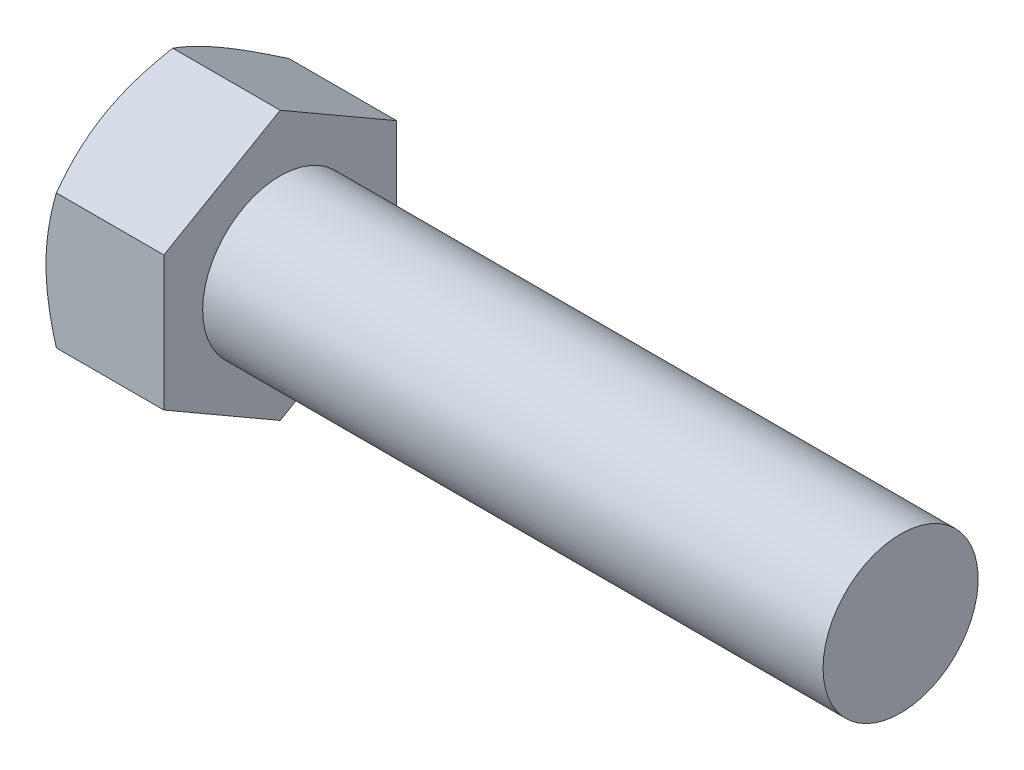
ISO-10303-21;
HEADER;
FILE_DESCRIPTION(('STEP AP214'),'2;1');
FILE_NAME('part.step','',(''),(''),'','','');
FILE_SCHEMA(('AUTOMOTIVE_DESIGN { 1 0 10303 214 1 1 1 1 }'));
ENDSEC;
DATA;
#1=APPLICATION_CONTEXT('core data for automotive mechanical design processes');
#2=APPLICATION_PROTOCOL_DEFINITION('international standard','automotive_design',2000,#1);
#3=PRODUCT_CONTEXT('',#1,'mechanical');
#4=PRODUCT('Part','Part','',(#3));
#5=PRODUCT_RELATED_PRODUCT_CATEGORY('part','',(#4));
#6=PRODUCT_DEFINITION_FORMATION('','',#4);
#7=PRODUCT_DEFINITION_CONTEXT('part definition',#1,'design');
#8=PRODUCT_DEFINITION('design','',#6,#7);
#9=PRODUCT_DEFINITION_SHAPE('','',#8);
#10=(LENGTH_UNIT() NAMED_UNIT(*) SI_UNIT(.MILLI.,.METRE.));
#11=(NAMED_UNIT(*) PLANE_ANGLE_UNIT() SI_UNIT($,.RADIAN.));
#12=(NAMED_UNIT(*) SI_UNIT($,.STERADIAN.) SOLID_ANGLE_UNIT());
#13=UNCERTAINTY_MEASURE_WITH_UNIT(LENGTH_MEASURE(1.E-05),#10,'distance_accuracy_value','');
#14=(GEOMETRIC_REPRESENTATION_CONTEXT(3) GLOBAL_UNCERTAINTY_ASSIGNED_CONTEXT((#13)) GLOBAL_UNIT_ASSIGNED_CONTEXT((#10,
#11,#12)) REPRESENTATION_CONTEXT('',''));
#15=CARTESIAN_POINT('',(0.,0.,0.));
#16=DIRECTION('',(0.,0.,1.));
#17=DIRECTION('',(1.,0.,0.));
#18=AXIS2_PLACEMENT_3D('',#15,#16,#17);
#19=CARTESIAN_POINT('',(4.826,3.175,0.));
#20=DIRECTION('',(-1.,0.,0.));
#21=DIRECTION('',(0.,0.,1.));
#22=AXIS2_PLACEMENT_3D('',#19,#20,#21);
#23=PLANE('',#22);
#24=CARTESIAN_POINT('',(4.826,0.,0.));
#25=DIRECTION('',(-1.,0.,0.));
#26=DIRECTION('',(0.,0.,1.));
#27=AXIS2_PLACEMENT_3D('',#24,#25,#26);
#28=CIRCLE('',#27,3.175);
#29=CARTESIAN_POINT('',(4.826,0.,3.175));
#30=VERTEX_POINT('',#29);
#31=EDGE_CURVE('E192',#30,#30,#28,.T.);
#32=ORIENTED_EDGE('',*,*,#31,.T.);
#33=EDGE_LOOP('',(#32));
#34=FACE_BOUND('',#33,.T.);
#35=DIRECTION('',(0.,1.,0.));
#36=VECTOR('',#35,1.);
#37=CARTESIAN_POINT('',(4.826,-2.74963066903106,4.7625));
#38=LINE('',#37,#36);
#39=CARTESIAN_POINT('',(4.826,-2.74963066903106,4.7625));
#40=VERTEX_POINT('',#39);
#41=CARTESIAN_POINT('',(4.826,2.74963066903132,4.7625));
#42=VERTEX_POINT('',#41);
#43=EDGE_CURVE('E56',#40,#42,#38,.T.);
#44=ORIENTED_EDGE('',*,*,#43,.F.);
#45=DIRECTION('',(0.,0.50000000163871,0.866025402838329));
#46=VECTOR('',#45,1.);
#47=CARTESIAN_POINT('',(4.826,-5.49926133806224,0.));
#48=LINE('',#47,#46);
#49=CARTESIAN_POINT('',(4.826,-5.49926133806224,0.));
#50=VERTEX_POINT('',#49);
#51=EDGE_CURVE('E129',#50,#40,#48,.T.);
#52=ORIENTED_EDGE('',*,*,#51,.F.);
#53=DIRECTION('',(0.,-0.50000000163871,0.866025402838329));
#54=VECTOR('',#53,1.);
#55=CARTESIAN_POINT('',(4.826,-2.74963066903106,-4.7625));
#56=LINE('',#55,#54);
#57=CARTESIAN_POINT('',(4.826,-2.74963066903106,-4.7625));
#58=VERTEX_POINT('',#57);
#59=EDGE_CURVE('E127',#58,#50,#56,.T.);
#60=ORIENTED_EDGE('',*,*,#59,.F.);
#61=DIRECTION('',(0.,-1.,0.));
#62=VECTOR('',#61,1.);
#63=CARTESIAN_POINT('',(4.826,2.74963066903132,-4.7625));
#64=LINE('',#63,#62);
#65=CARTESIAN_POINT('',(4.826,2.74963066903132,-4.7625));
#66=VERTEX_POINT('',#65);
#67=EDGE_CURVE('E110',#66,#58,#64,.T.);
#68=ORIENTED_EDGE('',*,*,#67,.F.);
#69=DIRECTION('',(0.,-0.50000000163871,-0.866025402838329));
#70=VECTOR('',#69,1.);
#71=CARTESIAN_POINT('',(4.826,5.4992613380625,0.));
#72=LINE('',#71,#70);
#73=CARTESIAN_POINT('',(4.826,5.4992613380625,0.));
#74=VERTEX_POINT('',#73);
#75=EDGE_CURVE('E119',#74,#66,#72,.T.);
#76=ORIENTED_EDGE('',*,*,#75,.F.);
#77=DIRECTION('',(0.,0.50000000163871,-0.866025402838329));
#78=VECTOR('',#77,1.);
#79=CARTESIAN_POINT('',(4.826,2.74963066903132,4.7625));
#80=LINE('',#79,#78);
#81=EDGE_CURVE('E123',#42,#74,#80,.T.);
#82=ORIENTED_EDGE('',*,*,#81,.F.);
#83=EDGE_LOOP('',(#44,#52,#60,#68,#76,#82));
#84=FACE_BOUND('',#83,.T.);
#85=ADVANCED_FACE('F33',(#34,#84),#23,.F.);
#86=CARTESIAN_POINT('',(-25.4,0.,0.));
#87=DIRECTION('',(-1.,0.,0.));
#88=DIRECTION('',(0.,0.,1.));
#89=AXIS2_PLACEMENT_3D('',#86,#87,#88);
#90=CYLINDRICAL_SURFACE('',#89,3.175);
#91=CARTESIAN_POINT('',(30.226,0.,0.));
#92=DIRECTION('',(-1.,0.,0.));
#93=DIRECTION('',(0.,0.,1.));
#94=AXIS2_PLACEMENT_3D('',#91,#92,#93);
#95=CIRCLE('',#94,3.175);
#96=CARTESIAN_POINT('',(30.226,0.,3.175));
#97=VERTEX_POINT('',#96);
#98=EDGE_CURVE('E11',#97,#97,#95,.T.);
#99=ORIENTED_EDGE('',*,*,#98,.T.);
#100=EDGE_LOOP('',(#99));
#101=FACE_BOUND('',#100,.T.);
#102=ORIENTED_EDGE('',*,*,#31,.F.);
#103=EDGE_LOOP('',(#102));
#104=FACE_BOUND('',#103,.T.);
#105=ADVANCED_FACE('F35',(#101,#104),#90,.T.);
#106=CARTESIAN_POINT('',(30.226,3.175,0.));
#107=DIRECTION('',(1.,0.,0.));
#108=DIRECTION('',(0.,0.,-1.));
#109=AXIS2_PLACEMENT_3D('',#106,#107,#108);
#110=PLANE('',#109);
#111=ORIENTED_EDGE('',*,*,#98,.F.);
#112=EDGE_LOOP('',(#111));
#113=FACE_BOUND('',#112,.T.);
#114=ADVANCED_FACE('F175',(#113),#110,.T.);
#115=CARTESIAN_POINT('',(4.826,-2.74963066903106,4.7625));
#116=DIRECTION('',(0.,0.,1.));
#117=DIRECTION('',(0.,-1.,0.));
#118=AXIS2_PLACEMENT_3D('',#115,#116,#117);
#119=PLANE('',#118);
#120=DIRECTION('',(-1.,0.,0.));
#121=VECTOR('',#120,1.);
#122=CARTESIAN_POINT('',(4.826,-2.74963066903106,4.7625));
#123=LINE('',#122,#121);
#124=CARTESIAN_POINT('',(0.425369346452972,-2.74963066903106,4.7625));
#125=VERTEX_POINT('',#124);
#126=EDGE_CURVE('E136',#40,#125,#123,.T.);
#127=ORIENTED_EDGE('',*,*,#126,.F.);
#128=ORIENTED_EDGE('',*,*,#43,.T.);
#129=DIRECTION('',(-1.,0.,0.));
#130=VECTOR('',#129,1.);
#131=CARTESIAN_POINT('',(4.826,2.74963066903132,4.7625));
#132=LINE('',#131,#130);
#133=CARTESIAN_POINT('',(0.425369346453047,2.74963066903132,4.7625));
#134=VERTEX_POINT('',#133);
#135=EDGE_CURVE('E135',#42,#134,#132,.T.);
#136=ORIENTED_EDGE('',*,*,#135,.T.);
#137=CARTESIAN_POINT('',(2.27898968394571,-7.29243864222315,4.7625));
#138=CARTESIAN_POINT('',(2.17794058217171,-7.08333786108627,4.7625));
#139=CARTESIAN_POINT('',(2.07789598854583,-6.87374269666669,4.7625));
#140=CARTESIAN_POINT('',(1.88038982686391,-6.45329629222594,4.7625));
#141=CARTESIAN_POINT('',(1.782928706027,-6.24244484236994,4.7625));
#142=CARTESIAN_POINT('',(1.59065007148966,-5.81807956190434,4.7625));
#143=CARTESIAN_POINT('',(1.49585087763059,-5.60455740055874,4.7625));
#144=CARTESIAN_POINT('',(1.31032432959035,-5.17575810623245,4.7625));
#145=CARTESIAN_POINT('',(1.21959676316398,-4.96048106542273,4.7625));
#146=CARTESIAN_POINT('',(1.04221901788485,-4.52515712229561,4.7625));
#147=CARTESIAN_POINT('',(0.955632573124922,-4.30508410805359,4.7625));
#148=CARTESIAN_POINT('',(0.789241130230124,-3.86234213608174,4.7625));
#149=CARTESIAN_POINT('',(0.709436886578048,-3.63967289266075,4.7625));
#150=CARTESIAN_POINT('',(0.558753932751852,-3.1918423334644,4.7625));
#151=CARTESIAN_POINT('',(0.48785624705175,-2.96668746712432,4.7625));
#152=CARTESIAN_POINT('',(0.357289753142522,-2.51317453212622,4.7625));
#153=CARTESIAN_POINT('',(0.297617393975245,-2.28481750106867,4.7625));
#154=CARTESIAN_POINT('',(0.192395409345153,-1.82475526773245,4.7625));
#155=CARTESIAN_POINT('',(0.146849543554863,-1.59304919127071,4.7625));
#156=CARTESIAN_POINT('',(0.0729585428796095,-1.126810996364,4.7625));
#157=CARTESIAN_POINT('',(0.0446134231880091,-0.892278875422989,4.7625));
#158=CARTESIAN_POINT('',(0.0168133679250281,-0.540107442829517,4.7625));
#159=CARTESIAN_POINT('',(0.00999820999909747,-0.423019411026591,4.7625));
#160=CARTESIAN_POINT('',(0.00132937135413627,-0.188654458262591,4.7625));
#161=CARTESIAN_POINT('',(-0.000524373797287396,-0.0713775397743245,4.7625));
#162=CARTESIAN_POINT('',(0.00077942189040161,0.163114394442293,4.7625));
#163=CARTESIAN_POINT('',(0.00393554785021348,0.280329418299315,4.7625));
#164=CARTESIAN_POINT('',(0.0151790484320769,0.514524696158315,4.7625));
#165=CARTESIAN_POINT('',(0.0232666859763377,0.63150493730927,4.7625));
#166=CARTESIAN_POINT('',(0.0486779652695836,0.9150414859633,4.7625));
#167=CARTESIAN_POINT('',(0.0684734060545629,1.08138054969973,4.7625));
#168=CARTESIAN_POINT('',(0.116932461176968,1.41275214392956,4.7625));
#169=CARTESIAN_POINT('',(0.145597258051477,1.57778449719037,4.7625));
#170=CARTESIAN_POINT('',(0.24338070321639,2.07082858080383,4.7625));
#171=CARTESIAN_POINT('',(0.324262812813244,2.39653421026766,4.7625));
#172=CARTESIAN_POINT('',(0.463764283356733,2.88389972996804,4.7625));
#173=CARTESIAN_POINT('',(0.514005661882685,3.04810170519661,4.7625));
#174=CARTESIAN_POINT('',(0.619459724259771,3.37479214932484,4.7625));
#175=CARTESIAN_POINT('',(0.674668979246428,3.53728171491266,4.7625));
#176=CARTESIAN_POINT('',(0.788910138521114,3.85986745605865,4.7625));
#177=CARTESIAN_POINT('',(0.84791877728242,4.01997195523197,4.7625));
#178=CARTESIAN_POINT('',(0.969399558980841,4.33893875423134,4.7625));
#179=CARTESIAN_POINT('',(1.0318731017376,4.49780052198193,4.7625));
#180=CARTESIAN_POINT('',(1.09573716116643,4.6560879202749,4.7625));
#181=B_SPLINE_CURVE_WITH_KNOTS('',3,(#137,#138,#139,#140,#141,#142,#143,#144,#145,#146,#147,
#148,#149,#150,#151,#152,#153,#154,#155,#156,#157,#158,#159,#160,#161,#162,#163,#164,#165,#166,
#167,#168,#169,#170,#171,#172,#173,#174,#175,#176,#177,#178,#179,#180),.UNSPECIFIED.,.F.,.F.,(4,
2,2,2,2,2,2,2,2,2,2,2,2,2,2,2,2,2,2,2,2,4),(0.,0.696720570955649,1.39356097225699,
2.09438908716602,2.79518062687273,3.50457590854337,4.21405000354128,4.92198595314229,
5.62969758019712,6.33759739870492,7.04549784249743,7.39726713471167,7.74903185858049,
8.10069725532668,8.4523814026581,8.95463428779779,9.45695416638885,10.4623537741734,
10.9774624129456,11.4922182078376,12.0040766168916,12.51614334455),.UNSPECIFIED.);
#182=CARTESIAN_POINT('',(0.,0.,4.7625));
#183=VERTEX_POINT('',#182);
#184=EDGE_CURVE('E177',#183,#134,#181,.T.);
#185=ORIENTED_EDGE('',*,*,#184,.F.);
#186=EDGE_CURVE('E184',#125,#183,#181,.T.);
#187=ORIENTED_EDGE('',*,*,#186,.F.);
#188=EDGE_LOOP('',(#127,#128,#136,#185,#187));
#189=FACE_BOUND('',#188,.T.);
#190=ADVANCED_FACE('F171',(#189),#119,.T.);
#191=CARTESIAN_POINT('',(4.826,-5.49926133806224,0.));
#192=DIRECTION('',(0.,-0.866025402838329,0.50000000163871));
#193=DIRECTION('',(0.,-0.50000000163871,-0.866025402838329));
#194=AXIS2_PLACEMENT_3D('',#191,#192,#193);
#195=PLANE('',#194);
#196=DIRECTION('',(-1.,0.,0.));
#197=VECTOR('',#196,1.);
#198=CARTESIAN_POINT('',(4.826,-5.49926133806224,0.));
#199=LINE('',#198,#197);
#200=CARTESIAN_POINT('',(0.425369356858742,-5.49926133806224,0.));
#201=VERTEX_POINT('',#200);
#202=EDGE_CURVE('E140',#50,#201,#199,.T.);
#203=ORIENTED_EDGE('',*,*,#202,.F.);
#204=ORIENTED_EDGE('',*,*,#51,.T.);
#205=ORIENTED_EDGE('',*,*,#126,.T.);
#206=CARTESIAN_POINT('',(0.425436025625394,-5.49937680811658,-0.000200000000000016));
#207=CARTESIAN_POINT('',(0.355653625778347,-5.37853891916049,0.209097362236712));
#208=CARTESIAN_POINT('',(0.292183277471782,-5.25666750095787,0.420184849631701));
#209=CARTESIAN_POINT('',(0.181395207938282,-5.01081435171888,0.846014993453616));
#210=CARTESIAN_POINT('',(0.134116676820618,-4.88682825251706,1.060765215765));
#211=CARTESIAN_POINT('',(0.0605335358719861,-4.64037373475042,1.48763696042632));
#212=CARTESIAN_POINT('',(0.0337388022945347,-4.51794369792845,1.69969200364785));
#213=CARTESIAN_POINT('',(0.00971113172868741,-4.33386797188021,2.01852051221028));
#214=CARTESIAN_POINT('',(0.0043946503872819,-4.27246740374335,2.12486941537218));
#215=CARTESIAN_POINT('',(-0.00075982750217743,-4.14960952087904,2.33766550967362));
#216=CARTESIAN_POINT('',(-0.000597993266693059,-4.08815220796297,2.44411269767575));
#217=CARTESIAN_POINT('',(0.00738495836413704,-3.91977562364833,2.73574949523919));
#218=CARTESIAN_POINT('',(0.0207924287053961,-3.8129121424672,2.92084247330975));
#219=CARTESIAN_POINT('',(0.0633078703071326,-3.59989442335662,3.28979998410941));
#220=CARTESIAN_POINT('',(0.0924303753138589,-3.49374093420005,3.47366321992585));
#221=CARTESIAN_POINT('',(0.165229259684717,-3.28029402255661,3.84336411399539));
#222=CARTESIAN_POINT('',(0.209214118634481,-3.17302753922631,4.02915511226082));
#223=CARTESIAN_POINT('',(0.309042284478702,-2.96009431694952,4.39796627025192));
#224=CARTESIAN_POINT('',(0.364862138680498,-2.85442485054553,4.58099115407251));
#225=CARTESIAN_POINT('',(0.425436015218968,-2.74951519897672,4.7627));
#226=B_SPLINE_CURVE_WITH_KNOTS('',3,(#206,#207,#208,#209,#210,#211,#212,#213,#214,#215,#216,
#217,#218,#219,#220,#221,#222,#223,#224,#225),.UNSPECIFIED.,.F.,.F.,(4,2,2,2,2,2,2,2,2,4),(0.,
0.754910193273288,1.51163484135091,2.24963135645337,2.61827337374929,2.98690400428954,
3.62867424314917,4.27103903059707,4.9276515435558,5.58297484948087),.UNSPECIFIED.);
#227=CARTESIAN_POINT('',(0.,-4.12444599453499,2.38125001560866));
#228=VERTEX_POINT('',#227);
#229=EDGE_CURVE('E186',#228,#125,#226,.T.);
#230=ORIENTED_EDGE('',*,*,#229,.F.);
#231=EDGE_CURVE('E185',#201,#228,#226,.T.);
#232=ORIENTED_EDGE('',*,*,#231,.F.);
#233=EDGE_LOOP('',(#203,#204,#205,#230,#232));
#234=FACE_BOUND('',#233,.T.);
#235=ADVANCED_FACE('F174',(#234),#195,.T.);
#236=CARTESIAN_POINT('',(4.826,-2.74963066903106,-4.7625));
#237=DIRECTION('',(0.,-0.866025402838329,-0.50000000163871));
#238=DIRECTION('',(0.,0.50000000163871,-0.866025402838329));
#239=AXIS2_PLACEMENT_3D('',#236,#237,#238);
#240=PLANE('',#239);
#241=DIRECTION('',(-1.,0.,0.));
#242=VECTOR('',#241,1.);
#243=CARTESIAN_POINT('',(4.826,-2.74963066903106,-4.7625));
#244=LINE('',#243,#242);
#245=CARTESIAN_POINT('',(0.425369346452972,-2.74963066903106,-4.7625));
#246=VERTEX_POINT('',#245);
#247=EDGE_CURVE('E116',#58,#246,#244,.T.);
#248=ORIENTED_EDGE('',*,*,#247,.F.);
#249=ORIENTED_EDGE('',*,*,#59,.T.);
#250=ORIENTED_EDGE('',*,*,#202,.T.);
#251=CARTESIAN_POINT('',(0.425436015218968,-2.74951519897672,-4.7627));
#252=CARTESIAN_POINT('',(0.355653616219907,-2.87035308764027,-4.55340263826999));
#253=CARTESIAN_POINT('',(0.292183268815608,-2.99222450554867,-4.34231515138461));
#254=CARTESIAN_POINT('',(0.181395201157988,-3.23807765417098,-3.91648500863082));
#255=CARTESIAN_POINT('',(0.134116671012961,-3.36206375305016,-3.70173478687824));
#256=CARTESIAN_POINT('',(0.0605335319999671,-3.60851827015918,-3.27486304335596));
#257=CARTESIAN_POINT('',(0.0337387993872834,-3.7309483066472,-3.06280800071286));
#258=CARTESIAN_POINT('',(0.00971113021715489,-3.91502403216466,-2.74397949306975));
#259=CARTESIAN_POINT('',(0.00439464933223811,-3.97642460012038,-2.6376305902216));
#260=CARTESIAN_POINT('',(-0.000759827673070107,-4.0992824826125,-2.42483449656481));
#261=CARTESIAN_POINT('',(-0.000597993009913187,-4.16073979533751,-2.31838730889361));
#262=CARTESIAN_POINT('',(0.00738495977249676,-4.32911637983276,-2.02675051101734));
#263=CARTESIAN_POINT('',(0.0207924309089107,-4.43597986137534,-1.84165753232074));
#264=CARTESIAN_POINT('',(0.0633078741411432,-4.64899758117966,-1.47270002031949));
#265=CARTESIAN_POINT('',(0.0924303799833767,-4.7551510706685,-1.28883678392755));
#266=CARTESIAN_POINT('',(0.16522926603298,-4.96859798296975,-0.91913588871864));
#267=CARTESIAN_POINT('',(0.209214125826844,-5.07586446662499,-0.733344889890397));
#268=CARTESIAN_POINT('',(0.309042293316556,-5.28879768953312,-0.364533730805782));
#269=CARTESIAN_POINT('',(0.36486214831941,-5.39446715624358,-0.181508846454357));
#270=CARTESIAN_POINT('',(0.425436025625394,-5.49937680811658,0.000200000000000744));
#271=B_SPLINE_CURVE_WITH_KNOTS('',3,(#251,#252,#253,#254,#255,#256,#257,#258,#259,#260,#261,
#262,#263,#264,#265,#266,#267,#268,#269,#270),.UNSPECIFIED.,.F.,.F.,(4,2,2,2,2,2,2,2,2,4),(0.,
0.754910190878033,1.51163483650218,2.24963134929809,2.61827336544978,2.98690399484647,
3.62867423601538,4.27103902578001,4.92765154116022,5.58297484947947),.UNSPECIFIED.);
#272=CARTESIAN_POINT('',(0.,-4.12444599453499,-2.38125001560865));
#273=VERTEX_POINT('',#272);
#274=EDGE_CURVE('E215',#273,#201,#271,.T.);
#275=ORIENTED_EDGE('',*,*,#274,.F.);
#276=EDGE_CURVE('E220',#246,#273,#271,.T.);
#277=ORIENTED_EDGE('',*,*,#276,.F.);
#278=EDGE_LOOP('',(#248,#249,#250,#275,#277));
#279=FACE_BOUND('',#278,.T.);
#280=ADVANCED_FACE('F289',(#279),#240,.T.);
#281=CARTESIAN_POINT('',(4.826,2.74963066903132,-4.7625));
#282=DIRECTION('',(0.,0.,-1.));
#283=DIRECTION('',(-1.,0.,0.));
#284=AXIS2_PLACEMENT_3D('',#281,#282,#283);
#285=PLANE('',#284);
#286=DIRECTION('',(-1.,0.,0.));
#287=VECTOR('',#286,1.);
#288=CARTESIAN_POINT('',(4.826,2.74963066903132,-4.7625));
#289=LINE('',#288,#287);
#290=CARTESIAN_POINT('',(0.425369346453046,2.74963066903132,-4.7625));
#291=VERTEX_POINT('',#290);
#292=EDGE_CURVE('E105',#66,#291,#289,.T.);
#293=ORIENTED_EDGE('',*,*,#292,.F.);
#294=ORIENTED_EDGE('',*,*,#67,.T.);
#295=ORIENTED_EDGE('',*,*,#247,.T.);
#296=CARTESIAN_POINT('',(2.27898968394571,-7.29243864222315,-4.7625));
#297=CARTESIAN_POINT('',(2.17794058217172,-7.08333786108627,-4.7625));
#298=CARTESIAN_POINT('',(2.07789598854583,-6.87374269666669,-4.7625));
#299=CARTESIAN_POINT('',(1.88038982686392,-6.45329629222594,-4.7625));
#300=CARTESIAN_POINT('',(1.782928706027,-6.24244484236994,-4.7625));
#301=CARTESIAN_POINT('',(1.59065007148966,-5.81807956190434,-4.7625));
#302=CARTESIAN_POINT('',(1.49585087763059,-5.60455740055874,-4.7625));
#303=CARTESIAN_POINT('',(1.31032432959035,-5.17575810623245,-4.7625));
#304=CARTESIAN_POINT('',(1.21959676316398,-4.96048106542273,-4.7625));
#305=CARTESIAN_POINT('',(1.04221901788485,-4.52515712229561,-4.7625));
#306=CARTESIAN_POINT('',(0.955632573124923,-4.3050841080536,-4.7625));
#307=CARTESIAN_POINT('',(0.789241130230124,-3.86234213608174,-4.7625));
#308=CARTESIAN_POINT('',(0.709436886578049,-3.63967289266075,-4.7625));
#309=CARTESIAN_POINT('',(0.558753932751853,-3.1918423334644,-4.7625));
#310=CARTESIAN_POINT('',(0.487856247051751,-2.96668746712432,-4.7625));
#311=CARTESIAN_POINT('',(0.357289753142522,-2.51317453212622,-4.7625));
#312=CARTESIAN_POINT('',(0.297617393975246,-2.28481750106867,-4.7625));
#313=CARTESIAN_POINT('',(0.192395409345153,-1.82475526773245,-4.7625));
#314=CARTESIAN_POINT('',(0.146849543554863,-1.59304919127071,-4.7625));
#315=CARTESIAN_POINT('',(0.0729585428796094,-1.126810996364,-4.7625));
#316=CARTESIAN_POINT('',(0.0446134231880095,-0.892278875422989,-4.7625));
#317=CARTESIAN_POINT('',(0.0168133679250281,-0.540107442829517,-4.7625));
#318=CARTESIAN_POINT('',(0.00999820999909715,-0.423019411026591,-4.7625));
#319=CARTESIAN_POINT('',(0.00132937135413567,-0.188654458262592,-4.7625));
#320=CARTESIAN_POINT('',(-0.000524373797287923,-0.0713775397743246,-4.7625));
#321=CARTESIAN_POINT('',(0.000779421890401116,0.163114394442293,-4.7625));
#322=CARTESIAN_POINT('',(0.00393554785021292,0.280329418299315,-4.7625));
#323=CARTESIAN_POINT('',(0.0151790484320763,0.514524696158315,-4.7625));
#324=CARTESIAN_POINT('',(0.0232666859763371,0.63150493730927,-4.7625));
#325=CARTESIAN_POINT('',(0.0486779652695828,0.9150414859633,-4.7625));
#326=CARTESIAN_POINT('',(0.0684734060545617,1.08138054969973,-4.7625));
#327=CARTESIAN_POINT('',(0.116932461176967,1.41275214392956,-4.7625));
#328=CARTESIAN_POINT('',(0.145597258051476,1.57778449719037,-4.7625));
#329=CARTESIAN_POINT('',(0.243380703216389,2.07082858080383,-4.7625));
#330=CARTESIAN_POINT('',(0.324262812813243,2.39653421026766,-4.7625));
#331=CARTESIAN_POINT('',(0.463764283356732,2.88389972996804,-4.7625));
#332=CARTESIAN_POINT('',(0.514005661882684,3.04810170519661,-4.7625));
#333=CARTESIAN_POINT('',(0.61945972425977,3.37479214932484,-4.7625));
#334=CARTESIAN_POINT('',(0.674668979246428,3.53728171491266,-4.7625));
#335=CARTESIAN_POINT('',(0.788910138521113,3.85986745605865,-4.7625));
#336=CARTESIAN_POINT('',(0.847918777282418,4.01997195523197,-4.7625));
#337=CARTESIAN_POINT('',(0.96939955898084,4.33893875423134,-4.7625));
#338=CARTESIAN_POINT('',(1.0318731017376,4.49780052198193,-4.7625));
#339=CARTESIAN_POINT('',(1.09573716116642,4.6560879202749,-4.7625));
#340=B_SPLINE_CURVE_WITH_KNOTS('',3,(#296,#297,#298,#299,#300,#301,#302,#303,#304,#305,#306,
#307,#308,#309,#310,#311,#312,#313,#314,#315,#316,#317,#318,#319,#320,#321,#322,#323,#324,#325,
#326,#327,#328,#329,#330,#331,#332,#333,#334,#335,#336,#337,#338,#339),.UNSPECIFIED.,.F.,.F.,(4,
2,2,2,2,2,2,2,2,2,2,2,2,2,2,2,2,2,2,2,2,4),(0.,0.696720570955649,1.39356097225699,
2.09438908716602,2.79518062687273,3.50457590854337,4.21405000354128,4.92198595314229,
5.62969758019712,6.33759739870492,7.04549784249743,7.39726713471167,7.74903185858049,
8.10069725532668,8.4523814026581,8.95463428779779,9.45695416638885,10.4623537741734,
10.9774624129456,11.4922182078376,12.0040766168916,12.51614334455),.UNSPECIFIED.);
#341=CARTESIAN_POINT('',(0.,0.,-4.7625));
#342=VERTEX_POINT('',#341);
#343=EDGE_CURVE('E216',#342,#246,#340,.F.);
#344=ORIENTED_EDGE('',*,*,#343,.F.);
#345=EDGE_CURVE('E113',#291,#342,#340,.F.);
#346=ORIENTED_EDGE('',*,*,#345,.F.);
#347=EDGE_LOOP('',(#293,#294,#295,#344,#346));
#348=FACE_BOUND('',#347,.T.);
#349=ADVANCED_FACE('F107',(#348),#285,.T.);
#350=CARTESIAN_POINT('',(4.826,5.4992613380625,0.));
#351=DIRECTION('',(0.,0.866025402838329,-0.50000000163871));
#352=DIRECTION('',(0.,0.50000000163871,0.866025402838329));
#353=AXIS2_PLACEMENT_3D('',#350,#351,#352);
#354=PLANE('',#353);
#355=DIRECTION('',(-1.,0.,0.));
#356=VECTOR('',#355,1.);
#357=CARTESIAN_POINT('',(4.826,5.4992613380625,0.));
#358=LINE('',#357,#356);
#359=CARTESIAN_POINT('',(0.425369356858891,5.4992613380625,0.));
#360=VERTEX_POINT('',#359);
#361=EDGE_CURVE('E48',#74,#360,#358,.T.);
#362=ORIENTED_EDGE('',*,*,#361,.F.);
#363=ORIENTED_EDGE('',*,*,#75,.T.);
#364=ORIENTED_EDGE('',*,*,#292,.T.);
#365=CARTESIAN_POINT('',(0.425436025625542,5.49937680811684,0.000200000000000336));
#366=CARTESIAN_POINT('',(0.355653625778492,5.37853891916074,-0.209097362236721));
#367=CARTESIAN_POINT('',(0.292183277471924,5.25666750095811,-0.420184849631721));
#368=CARTESIAN_POINT('',(0.181395207938419,5.01081435171911,-0.846014993453656));
#369=CARTESIAN_POINT('',(0.134116676820753,4.88682825251729,-1.06076521576505));
#370=CARTESIAN_POINT('',(0.060533535872117,4.64037373475064,-1.48763696042639));
#371=CARTESIAN_POINT('',(0.0337388022946642,4.51794369792866,-1.69969200364793));
#372=CARTESIAN_POINT('',(0.0097111317288161,4.33386797188041,-2.01852051221038));
#373=CARTESIAN_POINT('',(0.00439465038741052,4.27246740374355,-2.12486941537228));
#374=CARTESIAN_POINT('',(-0.000759827502048906,4.14960952087923,-2.33766550967373));
#375=CARTESIAN_POINT('',(-0.000597993266564577,4.08815220796316,-2.44411269767586));
#376=CARTESIAN_POINT('',(0.00738495836426527,3.91977562364853,-2.7357494952393));
#377=CARTESIAN_POINT('',(0.0207924287055227,3.8129121424674,-2.92084247330985));
#378=CARTESIAN_POINT('',(0.0633078703072537,3.59989442335683,-3.28979998410948));
#379=CARTESIAN_POINT('',(0.092430375313976,3.49374093420026,-3.47366321992591));
#380=CARTESIAN_POINT('',(0.165229259684824,3.28029402255683,-3.84336411399544));
#381=CARTESIAN_POINT('',(0.209214118634582,3.17302753922654,-4.02915511226086));
#382=CARTESIAN_POINT('',(0.309042284478791,2.96009431694976,-4.39796627025194));
#383=CARTESIAN_POINT('',(0.364862138680579,2.85442485054578,-4.58099115407252));
#384=CARTESIAN_POINT('',(0.425436015219042,2.74951519897697,-4.7627));
#385=B_SPLINE_CURVE_WITH_KNOTS('',3,(#365,#366,#367,#368,#369,#370,#371,#372,#373,#374,#375,
#376,#377,#378,#379,#380,#381,#382,#383,#384),.UNSPECIFIED.,.F.,.F.,(4,2,2,2,2,2,2,2,2,4),(0.,
0.754910193273323,1.51163484135098,2.24963135645348,2.61827337374941,2.98690400428968,
3.62867424314928,4.27103903059714,4.92765154355583,5.58297484948086),.UNSPECIFIED.);
#386=CARTESIAN_POINT('',(0.,4.12444599453518,-2.38125001560877));
#387=VERTEX_POINT('',#386);
#388=EDGE_CURVE('E154',#387,#291,#385,.T.);
#389=ORIENTED_EDGE('',*,*,#388,.F.);
#390=EDGE_CURVE('E279',#360,#387,#385,.T.);
#391=ORIENTED_EDGE('',*,*,#390,.F.);
#392=EDGE_LOOP('',(#362,#363,#364,#389,#391));
#393=FACE_BOUND('',#392,.T.);
#394=ADVANCED_FACE('F120',(#393),#354,.T.);
#395=CARTESIAN_POINT('',(4.826,2.74963066903132,4.7625));
#396=DIRECTION('',(0.,0.866025402838329,0.50000000163871));
#397=DIRECTION('',(0.,-0.50000000163871,0.866025402838329));
#398=AXIS2_PLACEMENT_3D('',#395,#396,#397);
#399=PLANE('',#398);
#400=ORIENTED_EDGE('',*,*,#135,.F.);
#401=ORIENTED_EDGE('',*,*,#81,.T.);
#402=ORIENTED_EDGE('',*,*,#361,.T.);
#403=CARTESIAN_POINT('',(0.425436015219043,2.74951519897697,4.7627));
#404=CARTESIAN_POINT('',(0.355653616219984,2.87035308764053,4.55340263826998));
#405=CARTESIAN_POINT('',(0.292183268815689,2.99222450554893,4.3423151513846));
#406=CARTESIAN_POINT('',(0.181395201158077,3.23807765417125,3.9164850086308));
#407=CARTESIAN_POINT('',(0.134116671013054,3.36206375305044,3.70173478687822));
#408=CARTESIAN_POINT('',(0.0605335320000706,3.60851827015946,3.27486304335591));
#409=CARTESIAN_POINT('',(0.0337387993873925,3.73094830664748,3.06280800071281));
#410=CARTESIAN_POINT('',(0.00971113021727249,3.91502403216495,2.7439794930697));
#411=CARTESIAN_POINT('',(0.0043946493323586,3.97642460012067,2.63763059022154));
#412=CARTESIAN_POINT('',(-0.000759827672943466,4.09928248261279,2.42483449656475));
#413=CARTESIAN_POINT('',(-0.000597993009783267,4.1607397953378,2.31838730889354));
#414=CARTESIAN_POINT('',(0.00738495977263506,4.32911637983306,2.02675051101727));
#415=CARTESIAN_POINT('',(0.0207924309090529,4.43597986137563,1.84165753232068));
#416=CARTESIAN_POINT('',(0.0633078741412913,4.64899758117994,1.47270002031945));
#417=CARTESIAN_POINT('',(0.0924303799835269,4.75515107066878,1.28883678392751));
#418=CARTESIAN_POINT('',(0.165229266033132,4.96859798297002,0.919135888718611));
#419=CARTESIAN_POINT('',(0.209214125826997,5.07586446662526,0.733344889890374));
#420=CARTESIAN_POINT('',(0.309042293316708,5.28879768953338,0.364533730805772));
#421=CARTESIAN_POINT('',(0.36486214831956,5.39446715624384,0.181508846454352));
#422=CARTESIAN_POINT('',(0.425436025625542,5.49937680811684,-0.00020000000000039));
#423=B_SPLINE_CURVE_WITH_KNOTS('',3,(#403,#404,#405,#406,#407,#408,#409,#410,#411,#412,#413,
#414,#415,#416,#417,#418,#419,#420,#421,#422),.UNSPECIFIED.,.F.,.F.,(4,2,2,2,2,2,2,2,2,4),(0.,
0.754910190878051,1.51163483650222,2.24963134929815,2.61827336544985,2.98690399484654,
3.62867423601543,4.27103902578005,4.92765154116023,5.58297484947946),.UNSPECIFIED.);
#424=CARTESIAN_POINT('',(0.,4.12444599453518,2.38125001560877));
#425=VERTEX_POINT('',#424);
#426=EDGE_CURVE('E139',#425,#360,#423,.T.);
#427=ORIENTED_EDGE('',*,*,#426,.F.);
#428=EDGE_CURVE('E153',#134,#425,#423,.T.);
#429=ORIENTED_EDGE('',*,*,#428,.F.);
#430=EDGE_LOOP('',(#400,#401,#402,#427,#429));
#431=FACE_BOUND('',#430,.T.);
#432=ADVANCED_FACE('F164',(#431),#399,.T.);
#433=CARTESIAN_POINT('',(0.,0.,0.));
#434=DIRECTION('',(1.,0.,0.));
#435=DIRECTION('',(0.,0.,-1.));
#436=AXIS2_PLACEMENT_3D('',#433,#434,#435);
#437=CONICAL_SURFACE('',#436,4.7625,1.0471975511966);
#438=CARTESIAN_POINT('',(0.,0.,0.));
#439=DIRECTION('',(-1.,0.,0.));
#440=DIRECTION('',(0.,0.,1.));
#441=AXIS2_PLACEMENT_3D('',#438,#439,#440);
#442=CIRCLE('',#441,4.7625);
#443=EDGE_CURVE('E194',#228,#183,#442,.T.);
#444=ORIENTED_EDGE('',*,*,#443,.F.);
#445=ORIENTED_EDGE('',*,*,#229,.T.);
#446=ORIENTED_EDGE('',*,*,#186,.T.);
#447=EDGE_LOOP('',(#444,#445,#446));
#448=FACE_BOUND('',#447,.T.);
#449=ADVANCED_FACE('F168',(#448),#437,.T.);
#450=EDGE_CURVE('E202',#273,#228,#442,.T.);
#451=ORIENTED_EDGE('',*,*,#450,.F.);
#452=ORIENTED_EDGE('',*,*,#274,.T.);
#453=ORIENTED_EDGE('',*,*,#231,.T.);
#454=EDGE_LOOP('',(#451,#452,#453));
#455=FACE_BOUND('',#454,.T.);
#456=ADVANCED_FACE('F225',(#455),#437,.T.);
#457=ORIENTED_EDGE('',*,*,#343,.T.);
#458=ORIENTED_EDGE('',*,*,#276,.T.);
#459=EDGE_CURVE('E205',#342,#273,#442,.T.);
#460=ORIENTED_EDGE('',*,*,#459,.F.);
#461=EDGE_LOOP('',(#457,#458,#460));
#462=FACE_BOUND('',#461,.T.);
#463=ADVANCED_FACE('F160',(#462),#437,.T.);
#464=ORIENTED_EDGE('',*,*,#388,.T.);
#465=ORIENTED_EDGE('',*,*,#345,.T.);
#466=EDGE_CURVE('E201',#387,#342,#442,.T.);
#467=ORIENTED_EDGE('',*,*,#466,.F.);
#468=EDGE_LOOP('',(#464,#465,#467));
#469=FACE_BOUND('',#468,.T.);
#470=ADVANCED_FACE('F214',(#469),#437,.T.);
#471=EDGE_CURVE('E41',#183,#425,#442,.T.);
#472=ORIENTED_EDGE('',*,*,#471,.F.);
#473=ORIENTED_EDGE('',*,*,#184,.T.);
#474=ORIENTED_EDGE('',*,*,#428,.T.);
#475=EDGE_LOOP('',(#472,#473,#474));
#476=FACE_BOUND('',#475,.T.);
#477=ADVANCED_FACE('F253',(#476),#437,.T.);
#478=CARTESIAN_POINT('',(0.,0.,0.));
#479=DIRECTION('',(-1.,0.,0.));
#480=DIRECTION('',(0.,0.,1.));
#481=AXIS2_PLACEMENT_3D('',#478,#479,#480);
#482=PLANE('',#481);
#483=CARTESIAN_POINT('',(0.,0.,0.));
#484=DIRECTION('',(1.,0.,0.));
#485=DIRECTION('',(0.,0.,-1.));
#486=AXIS2_PLACEMENT_3D('',#483,#484,#485);
#487=CIRCLE('',#486,4.1671875);
#488=CARTESIAN_POINT('',(0.,0.,-4.1671875));
#489=VERTEX_POINT('',#488);
#490=EDGE_CURVE('E233',#489,#489,#487,.T.);
#491=ORIENTED_EDGE('',*,*,#490,.T.);
#492=EDGE_LOOP('',(#491));
#493=FACE_BOUND('',#492,.T.);
#494=ORIENTED_EDGE('',*,*,#471,.T.);
#495=EDGE_CURVE('E196',#425,#387,#442,.T.);
#496=ORIENTED_EDGE('',*,*,#495,.T.);
#497=ORIENTED_EDGE('',*,*,#466,.T.);
#498=ORIENTED_EDGE('',*,*,#459,.T.);
#499=ORIENTED_EDGE('',*,*,#450,.T.);
#500=ORIENTED_EDGE('',*,*,#443,.T.);
#501=EDGE_LOOP('',(#494,#496,#497,#498,#499,#500));
#502=FACE_BOUND('',#501,.T.);
#503=ADVANCED_FACE('F211',(#493,#502),#482,.T.);
#504=ORIENTED_EDGE('',*,*,#426,.T.);
#505=ORIENTED_EDGE('',*,*,#390,.T.);
#506=ORIENTED_EDGE('',*,*,#495,.F.);
#507=EDGE_LOOP('',(#504,#505,#506));
#508=FACE_BOUND('',#507,.T.);
#509=ADVANCED_FACE('F243',(#508),#437,.T.);
#510=CARTESIAN_POINT('',(0.60325,0.,0.));
#511=DIRECTION('',(-1.,0.,0.));
#512=DIRECTION('',(0.,0.,1.));
#513=AXIS2_PLACEMENT_3D('',#510,#511,#512);
#514=CYLINDRICAL_SURFACE('',#513,4.1671875);
#515=CARTESIAN_POINT('',(0.60325,0.,0.));
#516=DIRECTION('',(1.,0.,0.));
#517=DIRECTION('',(0.,0.,-1.));
#518=AXIS2_PLACEMENT_3D('',#515,#516,#517);
#519=CIRCLE('',#518,4.1671875);
#520=CARTESIAN_POINT('',(0.60325,0.,-4.1671875));
#521=VERTEX_POINT('',#520);
#522=EDGE_CURVE('E230',#521,#521,#519,.T.);
#523=ORIENTED_EDGE('',*,*,#522,.T.);
#524=EDGE_LOOP('',(#523));
#525=FACE_BOUND('',#524,.T.);
#526=ORIENTED_EDGE('',*,*,#490,.F.);
#527=EDGE_LOOP('',(#526));
#528=FACE_BOUND('',#527,.T.);
#529=ADVANCED_FACE('F240',(#525,#528),#514,.F.);
#530=CARTESIAN_POINT('',(0.60325,0.,0.));
#531=DIRECTION('',(1.,0.,0.));
#532=DIRECTION('',(0.,0.,-1.));
#533=AXIS2_PLACEMENT_3D('',#530,#531,#532);
#534=PLANE('',#533);
#535=ORIENTED_EDGE('',*,*,#522,.F.);
#536=EDGE_LOOP('',(#535));
#537=FACE_BOUND('',#536,.T.);
#538=ADVANCED_FACE('F242',(#537),#534,.F.);
#539=CLOSED_SHELL('',(#85,#105,#114,#190,#235,#280,#349,#394,#432,#449,#456,#463,#470,#477,#503,
#509,#529,#538));
#540=MANIFOLD_SOLID_BREP('B2',#539);
#541=ADVANCED_BREP_SHAPE_REPRESENTATION('',(#18,#540),#14);
#542=SHAPE_DEFINITION_REPRESENTATION(#9,#541);
ENDSEC;
END-ISO-10303-21;
